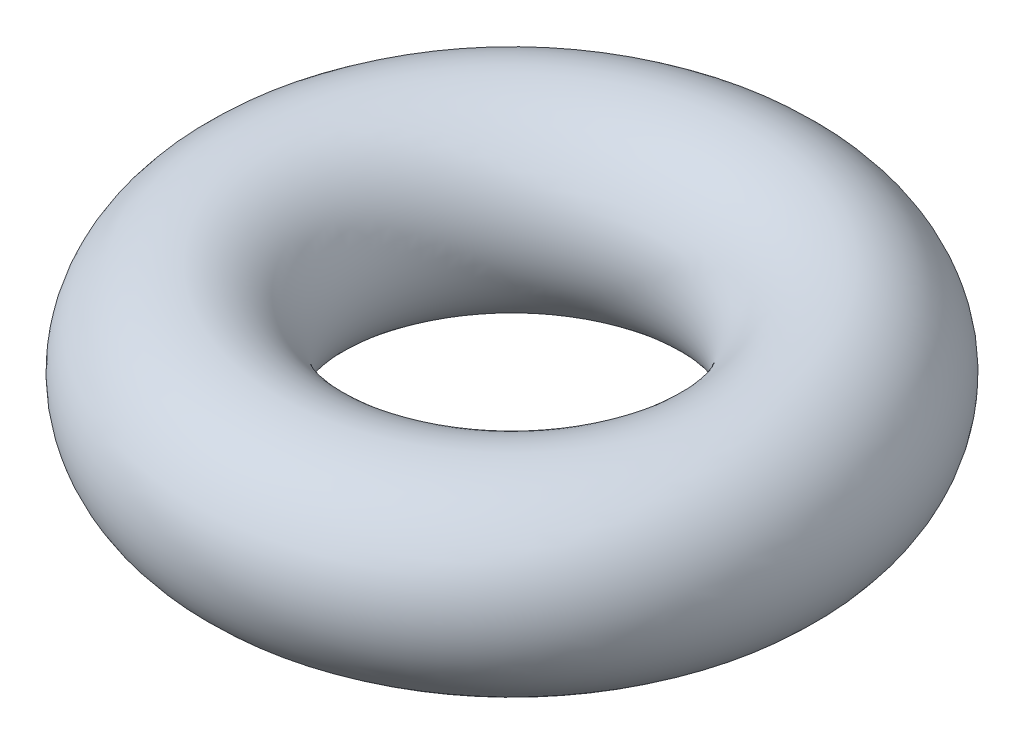
ISO-10303-21;
HEADER;
FILE_DESCRIPTION(('STEP AP214'),'2;1');
FILE_NAME('part.step','',(''),(''),'','','');
FILE_SCHEMA(('AUTOMOTIVE_DESIGN { 1 0 10303 214 1 1 1 1 }'));
ENDSEC;
DATA;
#1=APPLICATION_CONTEXT('core data for automotive mechanical design processes');
#2=APPLICATION_PROTOCOL_DEFINITION('international standard','automotive_design',2000,#1);
#3=PRODUCT_CONTEXT('',#1,'mechanical');
#4=PRODUCT('Part','Part','',(#3));
#5=PRODUCT_RELATED_PRODUCT_CATEGORY('part','',(#4));
#6=PRODUCT_DEFINITION_FORMATION('','',#4);
#7=PRODUCT_DEFINITION_CONTEXT('part definition',#1,'design');
#8=PRODUCT_DEFINITION('design','',#6,#7);
#9=PRODUCT_DEFINITION_SHAPE('','',#8);
#10=(LENGTH_UNIT() NAMED_UNIT(*) SI_UNIT(.MILLI.,.METRE.));
#11=(NAMED_UNIT(*) PLANE_ANGLE_UNIT() SI_UNIT($,.RADIAN.));
#12=(NAMED_UNIT(*) SI_UNIT($,.STERADIAN.) SOLID_ANGLE_UNIT());
#13=UNCERTAINTY_MEASURE_WITH_UNIT(LENGTH_MEASURE(1.E-05),#10,'distance_accuracy_value','');
#14=(GEOMETRIC_REPRESENTATION_CONTEXT(3) GLOBAL_UNCERTAINTY_ASSIGNED_CONTEXT((#13)) GLOBAL_UNIT_ASSIGNED_CONTEXT((#10,
#11,#12)) REPRESENTATION_CONTEXT('',''));
#15=CARTESIAN_POINT('',(0.,0.,0.));
#16=DIRECTION('',(0.,0.,1.));
#17=DIRECTION('',(1.,0.,0.));
#18=AXIS2_PLACEMENT_3D('',#15,#16,#17);
#19=CARTESIAN_POINT('',(0.,0.,0.));
#20=DIRECTION('',(0.,1.,0.));
#21=DIRECTION('',(0.,0.,1.));
#22=AXIS2_PLACEMENT_3D('',#19,#20,#21);
#23=TOROIDAL_SURFACE('',#22,2.5,1.);
#24=CARTESIAN_POINT('',(0.,0.,3.5));
#25=VERTEX_POINT('',#24);
#26=VERTEX_LOOP('',#25);
#27=FACE_BOUND('',#26,.T.);
#28=ADVANCED_FACE('F30',(#27),#23,.T.);
#29=CLOSED_SHELL('',(#28));
#30=MANIFOLD_SOLID_BREP('B2',#29);
#31=ADVANCED_BREP_SHAPE_REPRESENTATION('',(#18,#30),#14);
#32=SHAPE_DEFINITION_REPRESENTATION(#9,#31);
ENDSEC;
END-ISO-10303-21;
